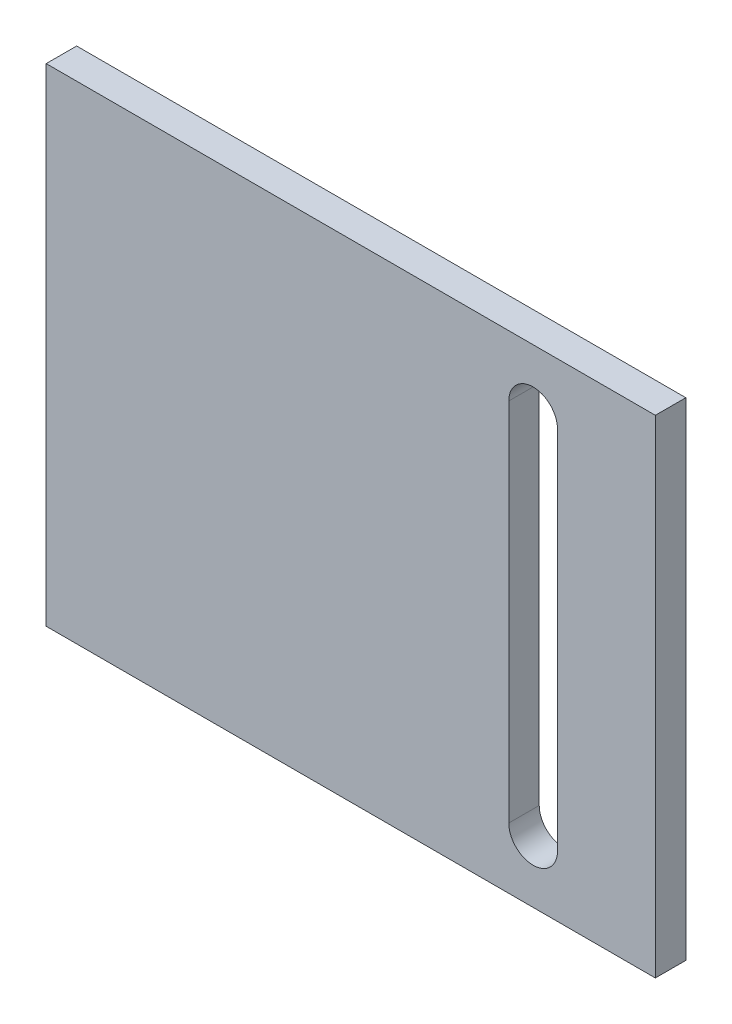
ISO-10303-21;
HEADER;
FILE_DESCRIPTION(('STEP AP214'),'2;1');
FILE_NAME('part.step','',(''),(''),'','','');
FILE_SCHEMA(('AUTOMOTIVE_DESIGN { 1 0 10303 214 1 1 1 1 }'));
ENDSEC;
DATA;
#1=APPLICATION_CONTEXT('core data for automotive mechanical design processes');
#2=APPLICATION_PROTOCOL_DEFINITION('international standard','automotive_design',2000,#1);
#3=PRODUCT_CONTEXT('',#1,'mechanical');
#4=PRODUCT('Part','Part','',(#3));
#5=PRODUCT_RELATED_PRODUCT_CATEGORY('part','',(#4));
#6=PRODUCT_DEFINITION_FORMATION('','',#4);
#7=PRODUCT_DEFINITION_CONTEXT('part definition',#1,'design');
#8=PRODUCT_DEFINITION('design','',#6,#7);
#9=PRODUCT_DEFINITION_SHAPE('','',#8);
#10=(LENGTH_UNIT() NAMED_UNIT(*) SI_UNIT(.MILLI.,.METRE.));
#11=(NAMED_UNIT(*) PLANE_ANGLE_UNIT() SI_UNIT($,.RADIAN.));
#12=(NAMED_UNIT(*) SI_UNIT($,.STERADIAN.) SOLID_ANGLE_UNIT());
#13=UNCERTAINTY_MEASURE_WITH_UNIT(LENGTH_MEASURE(1.E-05),#10,'distance_accuracy_value','');
#14=(GEOMETRIC_REPRESENTATION_CONTEXT(3) GLOBAL_UNCERTAINTY_ASSIGNED_CONTEXT((#13)) GLOBAL_UNIT_ASSIGNED_CONTEXT((#10,
#11,#12)) REPRESENTATION_CONTEXT('',''));
#15=CARTESIAN_POINT('',(0.,0.,0.));
#16=DIRECTION('',(0.,0.,1.));
#17=DIRECTION('',(1.,0.,0.));
#18=AXIS2_PLACEMENT_3D('',#15,#16,#17);
#19=CARTESIAN_POINT('',(0.,0.,5.));
#20=DIRECTION('',(0.,0.,1.));
#21=DIRECTION('',(1.,0.,0.));
#22=AXIS2_PLACEMENT_3D('',#19,#20,#21);
#23=PLANE('',#22);
#24=DIRECTION('',(0.,-1.,0.));
#25=VECTOR('',#24,1.);
#26=CARTESIAN_POINT('',(-5.9485530546624,36.9935691318328,5.));
#27=LINE('',#26,#25);
#28=CARTESIAN_POINT('',(-5.9485530546624,36.9935691318328,5.));
#29=VERTEX_POINT('',#28);
#30=CARTESIAN_POINT('',(-5.94855305466239,-43.0064308681672,5.));
#31=VERTEX_POINT('',#30);
#32=EDGE_CURVE('E134',#29,#31,#27,.T.);
#33=ORIENTED_EDGE('',*,*,#32,.T.);
#34=DIRECTION('',(1.,0.,0.));
#35=VECTOR('',#34,1.);
#36=CARTESIAN_POINT('',(-5.94855305466239,-43.0064308681672,5.));
#37=LINE('',#36,#35);
#38=CARTESIAN_POINT('',(94.0514469453376,-43.0064308681672,5.));
#39=VERTEX_POINT('',#38);
#40=EDGE_CURVE('E137',#31,#39,#37,.T.);
#41=ORIENTED_EDGE('',*,*,#40,.T.);
#42=DIRECTION('',(0.,1.,0.));
#43=VECTOR('',#42,1.);
#44=CARTESIAN_POINT('',(94.0514469453376,36.9935691318328,5.));
#45=LINE('',#44,#43);
#46=CARTESIAN_POINT('',(94.0514469453376,36.9935691318328,5.));
#47=VERTEX_POINT('',#46);
#48=EDGE_CURVE('E140',#39,#47,#45,.T.);
#49=ORIENTED_EDGE('',*,*,#48,.T.);
#50=DIRECTION('',(-1.,0.,0.));
#51=VECTOR('',#50,1.);
#52=CARTESIAN_POINT('',(-5.9485530546624,36.9935691318328,5.));
#53=LINE('',#52,#51);
#54=EDGE_CURVE('E142',#47,#29,#53,.T.);
#55=ORIENTED_EDGE('',*,*,#54,.T.);
#56=EDGE_LOOP('',(#33,#41,#49,#55));
#57=FACE_BOUND('',#56,.T.);
#58=DIRECTION('',(0.,-1.,0.));
#59=VECTOR('',#58,1.);
#60=CARTESIAN_POINT('',(69.9871382636656,26.9935691318328,5.));
#61=LINE('',#60,#59);
#62=CARTESIAN_POINT('',(69.9871382636656,26.9935691318328,5.));
#63=VERTEX_POINT('',#62);
#64=CARTESIAN_POINT('',(69.9871382636656,-33.0064308681672,5.));
#65=VERTEX_POINT('',#64);
#66=EDGE_CURVE('E106',#63,#65,#61,.T.);
#67=ORIENTED_EDGE('',*,*,#66,.F.);
#68=CARTESIAN_POINT('',(73.9871382636656,26.9935691318328,5.));
#69=DIRECTION('',(0.,0.,1.));
#70=DIRECTION('',(1.,0.,0.));
#71=AXIS2_PLACEMENT_3D('',#68,#69,#70);
#72=CIRCLE('',#71,4.00000000000001);
#73=CARTESIAN_POINT('',(77.9871382636656,26.9935691318328,5.));
#74=VERTEX_POINT('',#73);
#75=EDGE_CURVE('E98',#74,#63,#72,.T.);
#76=ORIENTED_EDGE('',*,*,#75,.F.);
#77=DIRECTION('',(0.,1.,0.));
#78=VECTOR('',#77,1.);
#79=CARTESIAN_POINT('',(77.9871382636656,26.9935691318328,5.));
#80=LINE('',#79,#78);
#81=CARTESIAN_POINT('',(77.9871382636656,-33.0064308681672,5.));
#82=VERTEX_POINT('',#81);
#83=EDGE_CURVE('E120',#82,#74,#80,.T.);
#84=ORIENTED_EDGE('',*,*,#83,.F.);
#85=CARTESIAN_POINT('',(73.9871382636656,-33.0064308681672,5.));
#86=DIRECTION('',(0.,0.,1.));
#87=DIRECTION('',(1.,0.,0.));
#88=AXIS2_PLACEMENT_3D('',#85,#86,#87);
#89=CIRCLE('',#88,4.00000000000001);
#90=EDGE_CURVE('E118',#65,#82,#89,.T.);
#91=ORIENTED_EDGE('',*,*,#90,.F.);
#92=EDGE_LOOP('',(#67,#76,#84,#91));
#93=FACE_BOUND('',#92,.T.);
#94=ADVANCED_FACE('F33',(#57,#93),#23,.T.);
#95=CARTESIAN_POINT('',(0.,0.,0.));
#96=DIRECTION('',(0.,0.,1.));
#97=DIRECTION('',(1.,0.,0.));
#98=AXIS2_PLACEMENT_3D('',#95,#96,#97);
#99=PLANE('',#98);
#100=DIRECTION('',(0.,-1.,0.));
#101=VECTOR('',#100,1.);
#102=CARTESIAN_POINT('',(-5.9485530546624,36.9935691318328,0.));
#103=LINE('',#102,#101);
#104=CARTESIAN_POINT('',(-5.9485530546624,36.9935691318328,0.));
#105=VERTEX_POINT('',#104);
#106=CARTESIAN_POINT('',(-5.94855305466239,-43.0064308681672,0.));
#107=VERTEX_POINT('',#106);
#108=EDGE_CURVE('E114',#105,#107,#103,.T.);
#109=ORIENTED_EDGE('',*,*,#108,.F.);
#110=DIRECTION('',(-1.,0.,0.));
#111=VECTOR('',#110,1.);
#112=CARTESIAN_POINT('',(-5.9485530546624,36.9935691318328,0.));
#113=LINE('',#112,#111);
#114=CARTESIAN_POINT('',(94.0514469453376,36.9935691318328,0.));
#115=VERTEX_POINT('',#114);
#116=EDGE_CURVE('E138',#115,#105,#113,.T.);
#117=ORIENTED_EDGE('',*,*,#116,.F.);
#118=DIRECTION('',(0.,1.,0.));
#119=VECTOR('',#118,1.);
#120=CARTESIAN_POINT('',(94.0514469453376,36.9935691318328,0.));
#121=LINE('',#120,#119);
#122=CARTESIAN_POINT('',(94.0514469453376,-43.0064308681672,0.));
#123=VERTEX_POINT('',#122);
#124=EDGE_CURVE('E149',#123,#115,#121,.T.);
#125=ORIENTED_EDGE('',*,*,#124,.F.);
#126=DIRECTION('',(1.,0.,0.));
#127=VECTOR('',#126,1.);
#128=CARTESIAN_POINT('',(-5.94855305466239,-43.0064308681672,0.));
#129=LINE('',#128,#127);
#130=EDGE_CURVE('E147',#107,#123,#129,.T.);
#131=ORIENTED_EDGE('',*,*,#130,.F.);
#132=EDGE_LOOP('',(#109,#117,#125,#131));
#133=FACE_BOUND('',#132,.T.);
#134=CARTESIAN_POINT('',(73.9871382636656,26.9935691318328,0.));
#135=DIRECTION('',(0.,0.,1.));
#136=DIRECTION('',(1.,0.,0.));
#137=AXIS2_PLACEMENT_3D('',#134,#135,#136);
#138=CIRCLE('',#137,4.00000000000001);
#139=CARTESIAN_POINT('',(77.9871382636656,26.9935691318328,0.));
#140=VERTEX_POINT('',#139);
#141=CARTESIAN_POINT('',(69.9871382636656,26.9935691318328,0.));
#142=VERTEX_POINT('',#141);
#143=EDGE_CURVE('E56',#140,#142,#138,.T.);
#144=ORIENTED_EDGE('',*,*,#143,.T.);
#145=DIRECTION('',(0.,-1.,0.));
#146=VECTOR('',#145,1.);
#147=CARTESIAN_POINT('',(69.9871382636656,26.9935691318328,0.));
#148=LINE('',#147,#146);
#149=CARTESIAN_POINT('',(69.9871382636656,-33.0064308681672,0.));
#150=VERTEX_POINT('',#149);
#151=EDGE_CURVE('E113',#142,#150,#148,.T.);
#152=ORIENTED_EDGE('',*,*,#151,.T.);
#153=CARTESIAN_POINT('',(73.9871382636656,-33.0064308681672,0.));
#154=DIRECTION('',(0.,0.,1.));
#155=DIRECTION('',(1.,0.,0.));
#156=AXIS2_PLACEMENT_3D('',#153,#154,#155);
#157=CIRCLE('',#156,4.00000000000001);
#158=CARTESIAN_POINT('',(77.9871382636656,-33.0064308681672,0.));
#159=VERTEX_POINT('',#158);
#160=EDGE_CURVE('E126',#150,#159,#157,.T.);
#161=ORIENTED_EDGE('',*,*,#160,.T.);
#162=DIRECTION('',(0.,1.,0.));
#163=VECTOR('',#162,1.);
#164=CARTESIAN_POINT('',(77.9871382636656,26.9935691318328,0.));
#165=LINE('',#164,#163);
#166=EDGE_CURVE('E107',#159,#140,#165,.T.);
#167=ORIENTED_EDGE('',*,*,#166,.T.);
#168=EDGE_LOOP('',(#144,#152,#161,#167));
#169=FACE_BOUND('',#168,.T.);
#170=ADVANCED_FACE('F167',(#133,#169),#99,.F.);
#171=CARTESIAN_POINT('',(-5.9485530546624,36.9935691318328,5.));
#172=DIRECTION('',(1.,0.,0.));
#173=DIRECTION('',(0.,1.,0.));
#174=AXIS2_PLACEMENT_3D('',#171,#172,#173);
#175=PLANE('',#174);
#176=ORIENTED_EDGE('',*,*,#108,.T.);
#177=DIRECTION('',(0.,0.,-1.));
#178=VECTOR('',#177,1.);
#179=CARTESIAN_POINT('',(-5.94855305466239,-43.0064308681672,5.));
#180=LINE('',#179,#178);
#181=EDGE_CURVE('E11',#31,#107,#180,.T.);
#182=ORIENTED_EDGE('',*,*,#181,.F.);
#183=ORIENTED_EDGE('',*,*,#32,.F.);
#184=DIRECTION('',(0.,0.,-1.));
#185=VECTOR('',#184,1.);
#186=CARTESIAN_POINT('',(-5.9485530546624,36.9935691318328,5.));
#187=LINE('',#186,#185);
#188=EDGE_CURVE('E144',#29,#105,#187,.T.);
#189=ORIENTED_EDGE('',*,*,#188,.T.);
#190=EDGE_LOOP('',(#176,#182,#183,#189));
#191=FACE_BOUND('',#190,.T.);
#192=ADVANCED_FACE('F35',(#191),#175,.F.);
#193=CARTESIAN_POINT('',(-5.94855305466239,-43.0064308681672,5.));
#194=DIRECTION('',(0.,1.,0.));
#195=DIRECTION('',(0.,0.,1.));
#196=AXIS2_PLACEMENT_3D('',#193,#194,#195);
#197=PLANE('',#196);
#198=ORIENTED_EDGE('',*,*,#130,.T.);
#199=DIRECTION('',(0.,0.,-1.));
#200=VECTOR('',#199,1.);
#201=CARTESIAN_POINT('',(94.0514469453376,-43.0064308681672,5.));
#202=LINE('',#201,#200);
#203=EDGE_CURVE('E41',#39,#123,#202,.T.);
#204=ORIENTED_EDGE('',*,*,#203,.F.);
#205=ORIENTED_EDGE('',*,*,#40,.F.);
#206=ORIENTED_EDGE('',*,*,#181,.T.);
#207=EDGE_LOOP('',(#198,#204,#205,#206));
#208=FACE_BOUND('',#207,.T.);
#209=ADVANCED_FACE('F177',(#208),#197,.F.);
#210=CARTESIAN_POINT('',(94.0514469453376,36.9935691318328,5.));
#211=DIRECTION('',(-1.,0.,0.));
#212=DIRECTION('',(0.,0.,1.));
#213=AXIS2_PLACEMENT_3D('',#210,#211,#212);
#214=PLANE('',#213);
#215=ORIENTED_EDGE('',*,*,#124,.T.);
#216=DIRECTION('',(0.,0.,-1.));
#217=VECTOR('',#216,1.);
#218=CARTESIAN_POINT('',(94.0514469453376,36.9935691318328,5.));
#219=LINE('',#218,#217);
#220=EDGE_CURVE('E154',#47,#115,#219,.T.);
#221=ORIENTED_EDGE('',*,*,#220,.F.);
#222=ORIENTED_EDGE('',*,*,#48,.F.);
#223=ORIENTED_EDGE('',*,*,#203,.T.);
#224=EDGE_LOOP('',(#215,#221,#222,#223));
#225=FACE_BOUND('',#224,.T.);
#226=ADVANCED_FACE('F161',(#225),#214,.F.);
#227=CARTESIAN_POINT('',(-5.9485530546624,36.9935691318328,5.));
#228=DIRECTION('',(0.,-1.,0.));
#229=DIRECTION('',(0.,0.,-1.));
#230=AXIS2_PLACEMENT_3D('',#227,#228,#229);
#231=PLANE('',#230);
#232=ORIENTED_EDGE('',*,*,#116,.T.);
#233=ORIENTED_EDGE('',*,*,#188,.F.);
#234=ORIENTED_EDGE('',*,*,#54,.F.);
#235=ORIENTED_EDGE('',*,*,#220,.T.);
#236=EDGE_LOOP('',(#232,#233,#234,#235));
#237=FACE_BOUND('',#236,.T.);
#238=ADVANCED_FACE('F171',(#237),#231,.F.);
#239=CARTESIAN_POINT('',(73.9871382636656,26.9935691318328,5.));
#240=DIRECTION('',(0.,0.,-1.));
#241=DIRECTION('',(-1.,0.,0.));
#242=AXIS2_PLACEMENT_3D('',#239,#240,#241);
#243=CYLINDRICAL_SURFACE('',#242,4.00000000000001);
#244=ORIENTED_EDGE('',*,*,#143,.F.);
#245=DIRECTION('',(0.,0.,-1.));
#246=VECTOR('',#245,1.);
#247=CARTESIAN_POINT('',(77.9871382636656,26.9935691318328,5.));
#248=LINE('',#247,#246);
#249=EDGE_CURVE('E102',#74,#140,#248,.T.);
#250=ORIENTED_EDGE('',*,*,#249,.F.);
#251=ORIENTED_EDGE('',*,*,#75,.T.);
#252=DIRECTION('',(0.,0.,-1.));
#253=VECTOR('',#252,1.);
#254=CARTESIAN_POINT('',(69.9871382636656,26.9935691318328,5.));
#255=LINE('',#254,#253);
#256=EDGE_CURVE('E101',#63,#142,#255,.T.);
#257=ORIENTED_EDGE('',*,*,#256,.T.);
#258=EDGE_LOOP('',(#244,#250,#251,#257));
#259=FACE_BOUND('',#258,.T.);
#260=ADVANCED_FACE('F100',(#259),#243,.F.);
#261=CARTESIAN_POINT('',(69.9871382636656,26.9935691318328,5.));
#262=DIRECTION('',(1.,0.,0.));
#263=DIRECTION('',(0.,1.,0.));
#264=AXIS2_PLACEMENT_3D('',#261,#262,#263);
#265=PLANE('',#264);
#266=ORIENTED_EDGE('',*,*,#151,.F.);
#267=ORIENTED_EDGE('',*,*,#256,.F.);
#268=ORIENTED_EDGE('',*,*,#66,.T.);
#269=DIRECTION('',(0.,0.,-1.));
#270=VECTOR('',#269,1.);
#271=CARTESIAN_POINT('',(69.9871382636656,-33.0064308681672,5.));
#272=LINE('',#271,#270);
#273=EDGE_CURVE('E115',#65,#150,#272,.T.);
#274=ORIENTED_EDGE('',*,*,#273,.T.);
#275=EDGE_LOOP('',(#266,#267,#268,#274));
#276=FACE_BOUND('',#275,.T.);
#277=ADVANCED_FACE('F110',(#276),#265,.T.);
#278=CARTESIAN_POINT('',(73.9871382636656,-33.0064308681672,5.));
#279=DIRECTION('',(0.,0.,-1.));
#280=DIRECTION('',(-1.,0.,0.));
#281=AXIS2_PLACEMENT_3D('',#278,#279,#280);
#282=CYLINDRICAL_SURFACE('',#281,4.00000000000001);
#283=ORIENTED_EDGE('',*,*,#160,.F.);
#284=ORIENTED_EDGE('',*,*,#273,.F.);
#285=ORIENTED_EDGE('',*,*,#90,.T.);
#286=DIRECTION('',(0.,0.,-1.));
#287=VECTOR('',#286,1.);
#288=CARTESIAN_POINT('',(77.9871382636656,-33.0064308681672,5.));
#289=LINE('',#288,#287);
#290=EDGE_CURVE('E48',#82,#159,#289,.T.);
#291=ORIENTED_EDGE('',*,*,#290,.T.);
#292=EDGE_LOOP('',(#283,#284,#285,#291));
#293=FACE_BOUND('',#292,.T.);
#294=ADVANCED_FACE('F200',(#293),#282,.F.);
#295=CARTESIAN_POINT('',(77.9871382636656,26.9935691318328,5.));
#296=DIRECTION('',(-1.,0.,0.));
#297=DIRECTION('',(0.,-1.,0.));
#298=AXIS2_PLACEMENT_3D('',#295,#296,#297);
#299=PLANE('',#298);
#300=ORIENTED_EDGE('',*,*,#166,.F.);
#301=ORIENTED_EDGE('',*,*,#290,.F.);
#302=ORIENTED_EDGE('',*,*,#83,.T.);
#303=ORIENTED_EDGE('',*,*,#249,.T.);
#304=EDGE_LOOP('',(#300,#301,#302,#303));
#305=FACE_BOUND('',#304,.T.);
#306=ADVANCED_FACE('F204',(#305),#299,.T.);
#307=CLOSED_SHELL('',(#94,#170,#192,#209,#226,#238,#260,#277,#294,#306));
#308=MANIFOLD_SOLID_BREP('B2',#307);
#309=ADVANCED_BREP_SHAPE_REPRESENTATION('',(#18,#308),#14);
#310=SHAPE_DEFINITION_REPRESENTATION(#9,#309);
ENDSEC;
END-ISO-10303-21;
